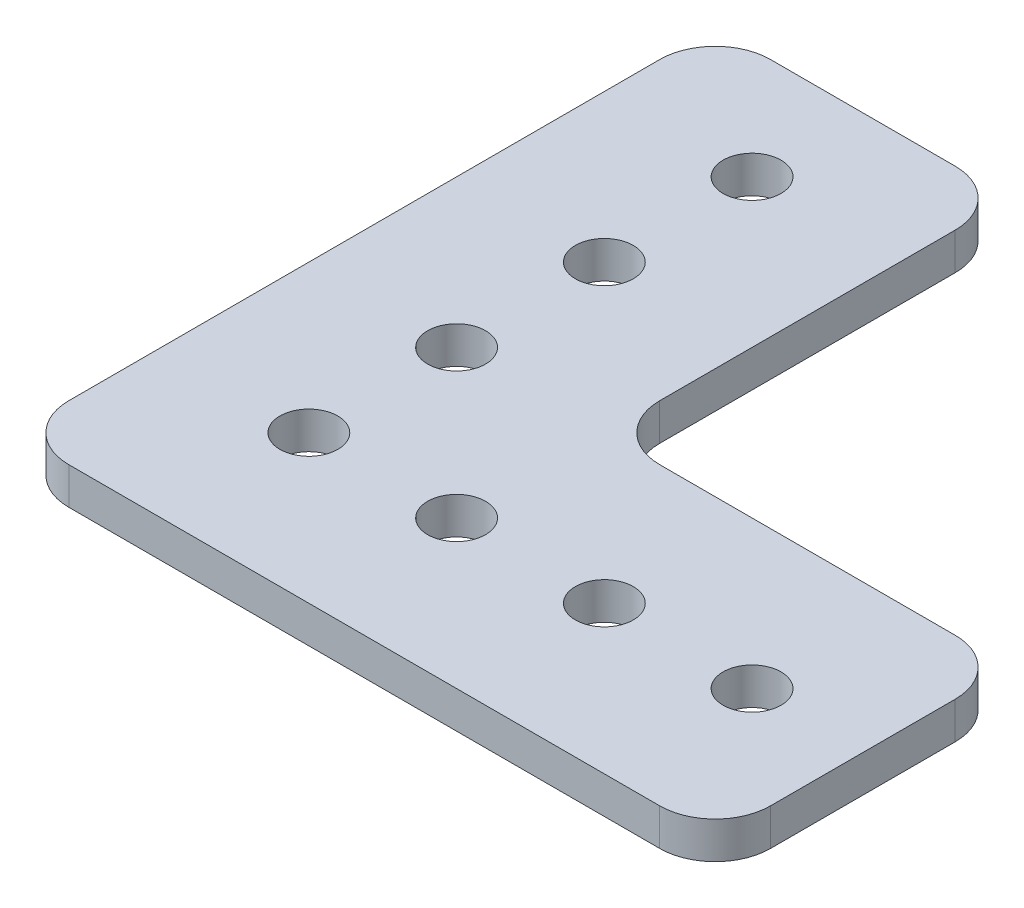
ISO-10303-21;
HEADER;
FILE_DESCRIPTION(('STEP AP214'),'2;1');
FILE_NAME('part.step','',(''),(''),'','','');
FILE_SCHEMA(('AUTOMOTIVE_DESIGN { 1 0 10303 214 1 1 1 1 }'));
ENDSEC;
DATA;
#1=APPLICATION_CONTEXT('core data for automotive mechanical design processes');
#2=APPLICATION_PROTOCOL_DEFINITION('international standard','automotive_design',2000,#1);
#3=PRODUCT_CONTEXT('',#1,'mechanical');
#4=PRODUCT('Part','Part','',(#3));
#5=PRODUCT_RELATED_PRODUCT_CATEGORY('part','',(#4));
#6=PRODUCT_DEFINITION_FORMATION('','',#4);
#7=PRODUCT_DEFINITION_CONTEXT('part definition',#1,'design');
#8=PRODUCT_DEFINITION('design','',#6,#7);
#9=PRODUCT_DEFINITION_SHAPE('','',#8);
#10=(LENGTH_UNIT() NAMED_UNIT(*) SI_UNIT(.MILLI.,.METRE.));
#11=(NAMED_UNIT(*) PLANE_ANGLE_UNIT() SI_UNIT($,.RADIAN.));
#12=(NAMED_UNIT(*) SI_UNIT($,.STERADIAN.) SOLID_ANGLE_UNIT());
#13=UNCERTAINTY_MEASURE_WITH_UNIT(LENGTH_MEASURE(1.E-05),#10,'distance_accuracy_value','');
#14=(GEOMETRIC_REPRESENTATION_CONTEXT(3) GLOBAL_UNCERTAINTY_ASSIGNED_CONTEXT((#13)) GLOBAL_UNIT_ASSIGNED_CONTEXT((#10,
#11,#12)) REPRESENTATION_CONTEXT('',''));
#15=CARTESIAN_POINT('',(0.,0.,0.));
#16=DIRECTION('',(0.,0.,1.));
#17=DIRECTION('',(1.,0.,0.));
#18=AXIS2_PLACEMENT_3D('',#15,#16,#17);
#19=CARTESIAN_POINT('',(0.,3.175,0.));
#20=DIRECTION('',(0.,-1.,0.));
#21=DIRECTION('',(0.,0.,-1.));
#22=AXIS2_PLACEMENT_3D('',#19,#20,#21);
#23=PLANE('',#22);
#24=DIRECTION('',(0.,0.,1.));
#25=VECTOR('',#24,1.);
#26=CARTESIAN_POINT('',(0.,3.175,0.));
#27=LINE('',#26,#25);
#28=CARTESIAN_POINT('',(0.,3.175,-55.5625));
#29=VERTEX_POINT('',#28);
#30=CARTESIAN_POINT('',(0.,3.175,-4.7625));
#31=VERTEX_POINT('',#30);
#32=EDGE_CURVE('E161',#29,#31,#27,.T.);
#33=ORIENTED_EDGE('',*,*,#32,.T.);
#34=CARTESIAN_POINT('',(4.7625,3.175,-4.7625));
#35=DIRECTION('',(0.,-1.,0.));
#36=DIRECTION('',(0.,0.,-1.));
#37=AXIS2_PLACEMENT_3D('',#34,#35,#36);
#38=CIRCLE('',#37,4.7625);
#39=CARTESIAN_POINT('',(4.76250000000002,3.175,0.));
#40=VERTEX_POINT('',#39);
#41=EDGE_CURVE('E189',#31,#40,#38,.F.);
#42=ORIENTED_EDGE('',*,*,#41,.T.);
#43=DIRECTION('',(1.,0.,0.));
#44=VECTOR('',#43,1.);
#45=CARTESIAN_POINT('',(60.325,3.175,0.));
#46=LINE('',#45,#44);
#47=CARTESIAN_POINT('',(55.5625,3.175,0.));
#48=VERTEX_POINT('',#47);
#49=EDGE_CURVE('E143',#40,#48,#46,.T.);
#50=ORIENTED_EDGE('',*,*,#49,.T.);
#51=CARTESIAN_POINT('',(55.5625,3.175,-4.7625));
#52=DIRECTION('',(0.,-1.,0.));
#53=DIRECTION('',(0.,0.,-1.));
#54=AXIS2_PLACEMENT_3D('',#51,#52,#53);
#55=CIRCLE('',#54,4.7625);
#56=CARTESIAN_POINT('',(60.325,3.175,-4.7625));
#57=VERTEX_POINT('',#56);
#58=EDGE_CURVE('E183',#48,#57,#55,.F.);
#59=ORIENTED_EDGE('',*,*,#58,.T.);
#60=DIRECTION('',(0.,0.,-1.));
#61=VECTOR('',#60,1.);
#62=CARTESIAN_POINT('',(60.325,3.175,-25.4));
#63=LINE('',#62,#61);
#64=CARTESIAN_POINT('',(60.325,3.175,-20.6375));
#65=VERTEX_POINT('',#64);
#66=EDGE_CURVE('E231',#57,#65,#63,.T.);
#67=ORIENTED_EDGE('',*,*,#66,.T.);
#68=CARTESIAN_POINT('',(55.5625,3.175,-20.6375));
#69=DIRECTION('',(0.,-1.,0.));
#70=DIRECTION('',(0.,0.,-1.));
#71=AXIS2_PLACEMENT_3D('',#68,#69,#70);
#72=CIRCLE('',#71,4.7625);
#73=CARTESIAN_POINT('',(55.5625,3.175,-25.4));
#74=VERTEX_POINT('',#73);
#75=EDGE_CURVE('E185',#65,#74,#72,.F.);
#76=ORIENTED_EDGE('',*,*,#75,.T.);
#77=DIRECTION('',(-1.,0.,0.));
#78=VECTOR('',#77,1.);
#79=CARTESIAN_POINT('',(25.4,3.175,-25.4));
#80=LINE('',#79,#78);
#81=CARTESIAN_POINT('',(30.1625,3.175,-25.4));
#82=VERTEX_POINT('',#81);
#83=EDGE_CURVE('E225',#74,#82,#80,.T.);
#84=ORIENTED_EDGE('',*,*,#83,.T.);
#85=CARTESIAN_POINT('',(30.1625,3.175,-30.1625));
#86=DIRECTION('',(0.,-1.,0.));
#87=DIRECTION('',(0.,0.,-1.));
#88=AXIS2_PLACEMENT_3D('',#85,#86,#87);
#89=CIRCLE('',#88,4.7625);
#90=CARTESIAN_POINT('',(25.4,3.175,-30.1625));
#91=VERTEX_POINT('',#90);
#92=EDGE_CURVE('E11',#82,#91,#89,.T.);
#93=ORIENTED_EDGE('',*,*,#92,.T.);
#94=DIRECTION('',(0.,0.,-1.));
#95=VECTOR('',#94,1.);
#96=CARTESIAN_POINT('',(25.4,3.175,-60.325));
#97=LINE('',#96,#95);
#98=CARTESIAN_POINT('',(25.4,3.175,-55.5625));
#99=VERTEX_POINT('',#98);
#100=EDGE_CURVE('E224',#91,#99,#97,.T.);
#101=ORIENTED_EDGE('',*,*,#100,.T.);
#102=CARTESIAN_POINT('',(20.6375,3.175,-55.5625));
#103=DIRECTION('',(0.,-1.,0.));
#104=DIRECTION('',(0.,0.,-1.));
#105=AXIS2_PLACEMENT_3D('',#102,#103,#104);
#106=CIRCLE('',#105,4.7625);
#107=CARTESIAN_POINT('',(20.6375,3.175,-60.325));
#108=VERTEX_POINT('',#107);
#109=EDGE_CURVE('E55',#99,#108,#106,.F.);
#110=ORIENTED_EDGE('',*,*,#109,.T.);
#111=DIRECTION('',(-1.,0.,0.));
#112=VECTOR('',#111,1.);
#113=CARTESIAN_POINT('',(0.,3.175,-60.325));
#114=LINE('',#113,#112);
#115=CARTESIAN_POINT('',(4.7625,3.175,-60.325));
#116=VERTEX_POINT('',#115);
#117=EDGE_CURVE('E229',#108,#116,#114,.T.);
#118=ORIENTED_EDGE('',*,*,#117,.T.);
#119=CARTESIAN_POINT('',(4.7625,3.175,-55.5625));
#120=DIRECTION('',(0.,-1.,0.));
#121=DIRECTION('',(0.,0.,-1.));
#122=AXIS2_PLACEMENT_3D('',#119,#120,#121);
#123=CIRCLE('',#122,4.7625);
#124=EDGE_CURVE('E187',#116,#29,#123,.F.);
#125=ORIENTED_EDGE('',*,*,#124,.T.);
#126=EDGE_LOOP('',(#33,#42,#50,#59,#67,#76,#84,#93,#101,#110,#118,#125));
#127=FACE_BOUND('',#126,.T.);
#128=CARTESIAN_POINT('',(12.7,3.175,-12.7));
#129=DIRECTION('',(0.,1.,0.));
#130=DIRECTION('',(0.,0.,1.));
#131=AXIS2_PLACEMENT_3D('',#128,#129,#130);
#132=CIRCLE('',#131,2.4892);
#133=CARTESIAN_POINT('',(12.7,3.175,-10.2108));
#134=VERTEX_POINT('',#133);
#135=EDGE_CURVE('E152',#134,#134,#132,.T.);
#136=ORIENTED_EDGE('',*,*,#135,.F.);
#137=EDGE_LOOP('',(#136));
#138=FACE_BOUND('',#137,.T.);
#139=CARTESIAN_POINT('',(50.8,3.175,-12.7));
#140=DIRECTION('',(0.,1.,0.));
#141=DIRECTION('',(0.,0.,1.));
#142=AXIS2_PLACEMENT_3D('',#139,#140,#141);
#143=CIRCLE('',#142,2.4892);
#144=CARTESIAN_POINT('',(50.8,3.175,-10.2108));
#145=VERTEX_POINT('',#144);
#146=EDGE_CURVE('E238',#145,#145,#143,.T.);
#147=ORIENTED_EDGE('',*,*,#146,.F.);
#148=EDGE_LOOP('',(#147));
#149=FACE_BOUND('',#148,.T.);
#150=CARTESIAN_POINT('',(12.7,3.175,-25.4));
#151=DIRECTION('',(0.,1.,0.));
#152=DIRECTION('',(0.,0.,1.));
#153=AXIS2_PLACEMENT_3D('',#150,#151,#152);
#154=CIRCLE('',#153,2.4892);
#155=CARTESIAN_POINT('',(12.7,3.175,-22.9108));
#156=VERTEX_POINT('',#155);
#157=EDGE_CURVE('E243',#156,#156,#154,.T.);
#158=ORIENTED_EDGE('',*,*,#157,.F.);
#159=EDGE_LOOP('',(#158));
#160=FACE_BOUND('',#159,.T.);
#161=CARTESIAN_POINT('',(12.7,3.175,-38.1));
#162=DIRECTION('',(0.,1.,0.));
#163=DIRECTION('',(0.,0.,1.));
#164=AXIS2_PLACEMENT_3D('',#161,#162,#163);
#165=CIRCLE('',#164,2.4892);
#166=CARTESIAN_POINT('',(12.7,3.175,-35.6108));
#167=VERTEX_POINT('',#166);
#168=EDGE_CURVE('E249',#167,#167,#165,.T.);
#169=ORIENTED_EDGE('',*,*,#168,.F.);
#170=EDGE_LOOP('',(#169));
#171=FACE_BOUND('',#170,.T.);
#172=CARTESIAN_POINT('',(25.4,3.175,-12.7));
#173=DIRECTION('',(0.,1.,0.));
#174=DIRECTION('',(0.,0.,1.));
#175=AXIS2_PLACEMENT_3D('',#172,#173,#174);
#176=CIRCLE('',#175,2.4892);
#177=CARTESIAN_POINT('',(25.4,3.175,-10.2108));
#178=VERTEX_POINT('',#177);
#179=EDGE_CURVE('E255',#178,#178,#176,.T.);
#180=ORIENTED_EDGE('',*,*,#179,.F.);
#181=EDGE_LOOP('',(#180));
#182=FACE_BOUND('',#181,.T.);
#183=CARTESIAN_POINT('',(38.1,3.175,-12.7));
#184=DIRECTION('',(0.,1.,0.));
#185=DIRECTION('',(0.,0.,1.));
#186=AXIS2_PLACEMENT_3D('',#183,#184,#185);
#187=CIRCLE('',#186,2.4892);
#188=CARTESIAN_POINT('',(38.1,3.175,-10.2108));
#189=VERTEX_POINT('',#188);
#190=EDGE_CURVE('E261',#189,#189,#187,.T.);
#191=ORIENTED_EDGE('',*,*,#190,.F.);
#192=EDGE_LOOP('',(#191));
#193=FACE_BOUND('',#192,.T.);
#194=CARTESIAN_POINT('',(12.7,3.175,-50.8));
#195=DIRECTION('',(0.,1.,0.));
#196=DIRECTION('',(0.,0.,1.));
#197=AXIS2_PLACEMENT_3D('',#194,#195,#196);
#198=CIRCLE('',#197,2.4892);
#199=CARTESIAN_POINT('',(12.7,3.175,-48.3108));
#200=VERTEX_POINT('',#199);
#201=EDGE_CURVE('E267',#200,#200,#198,.T.);
#202=ORIENTED_EDGE('',*,*,#201,.F.);
#203=EDGE_LOOP('',(#202));
#204=FACE_BOUND('',#203,.T.);
#205=ADVANCED_FACE('F33',(#127,#138,#149,#160,#171,#182,#193,#204),#23,.F.);
#206=CARTESIAN_POINT('',(0.,0.,0.));
#207=DIRECTION('',(0.,-1.,0.));
#208=DIRECTION('',(0.,0.,-1.));
#209=AXIS2_PLACEMENT_3D('',#206,#207,#208);
#210=PLANE('',#209);
#211=CARTESIAN_POINT('',(38.1,0.,-12.7));
#212=DIRECTION('',(0.,1.,0.));
#213=DIRECTION('',(0.,0.,1.));
#214=AXIS2_PLACEMENT_3D('',#211,#212,#213);
#215=CIRCLE('',#214,2.4892);
#216=CARTESIAN_POINT('',(38.1,0.,-10.2108));
#217=VERTEX_POINT('',#216);
#218=EDGE_CURVE('E264',#217,#217,#215,.T.);
#219=ORIENTED_EDGE('',*,*,#218,.T.);
#220=EDGE_LOOP('',(#219));
#221=FACE_BOUND('',#220,.T.);
#222=CARTESIAN_POINT('',(12.7,0.,-38.1));
#223=DIRECTION('',(0.,1.,0.));
#224=DIRECTION('',(0.,0.,1.));
#225=AXIS2_PLACEMENT_3D('',#222,#223,#224);
#226=CIRCLE('',#225,2.4892);
#227=CARTESIAN_POINT('',(12.7,0.,-35.6108));
#228=VERTEX_POINT('',#227);
#229=EDGE_CURVE('E252',#228,#228,#226,.T.);
#230=ORIENTED_EDGE('',*,*,#229,.T.);
#231=EDGE_LOOP('',(#230));
#232=FACE_BOUND('',#231,.T.);
#233=CARTESIAN_POINT('',(50.8,0.,-12.7));
#234=DIRECTION('',(0.,1.,0.));
#235=DIRECTION('',(0.,0.,1.));
#236=AXIS2_PLACEMENT_3D('',#233,#234,#235);
#237=CIRCLE('',#236,2.4892);
#238=CARTESIAN_POINT('',(50.8,0.,-10.2108));
#239=VERTEX_POINT('',#238);
#240=EDGE_CURVE('E240',#239,#239,#237,.T.);
#241=ORIENTED_EDGE('',*,*,#240,.T.);
#242=EDGE_LOOP('',(#241));
#243=FACE_BOUND('',#242,.T.);
#244=DIRECTION('',(1.,0.,0.));
#245=VECTOR('',#244,1.);
#246=CARTESIAN_POINT('',(60.325,0.,0.));
#247=LINE('',#246,#245);
#248=CARTESIAN_POINT('',(4.76250000000002,0.,0.));
#249=VERTEX_POINT('',#248);
#250=CARTESIAN_POINT('',(55.5625,0.,0.));
#251=VERTEX_POINT('',#250);
#252=EDGE_CURVE('E140',#249,#251,#247,.T.);
#253=ORIENTED_EDGE('',*,*,#252,.F.);
#254=CARTESIAN_POINT('',(4.7625,0.,-4.7625));
#255=DIRECTION('',(0.,-1.,0.));
#256=DIRECTION('',(0.,0.,-1.));
#257=AXIS2_PLACEMENT_3D('',#254,#255,#256);
#258=CIRCLE('',#257,4.7625);
#259=CARTESIAN_POINT('',(0.,0.,-4.7625));
#260=VERTEX_POINT('',#259);
#261=EDGE_CURVE('E123',#249,#260,#258,.T.);
#262=ORIENTED_EDGE('',*,*,#261,.T.);
#263=DIRECTION('',(0.,0.,1.));
#264=VECTOR('',#263,1.);
#265=CARTESIAN_POINT('',(0.,0.,0.));
#266=LINE('',#265,#264);
#267=CARTESIAN_POINT('',(0.,0.,-55.5625));
#268=VERTEX_POINT('',#267);
#269=EDGE_CURVE('E171',#268,#260,#266,.T.);
#270=ORIENTED_EDGE('',*,*,#269,.F.);
#271=CARTESIAN_POINT('',(4.7625,0.,-55.5625));
#272=DIRECTION('',(0.,-1.,0.));
#273=DIRECTION('',(0.,0.,-1.));
#274=AXIS2_PLACEMENT_3D('',#271,#272,#273);
#275=CIRCLE('',#274,4.7625);
#276=CARTESIAN_POINT('',(4.7625,0.,-60.325));
#277=VERTEX_POINT('',#276);
#278=EDGE_CURVE('E134',#268,#277,#275,.T.);
#279=ORIENTED_EDGE('',*,*,#278,.T.);
#280=DIRECTION('',(-1.,0.,0.));
#281=VECTOR('',#280,1.);
#282=CARTESIAN_POINT('',(0.,0.,-60.325));
#283=LINE('',#282,#281);
#284=CARTESIAN_POINT('',(20.6375,0.,-60.325));
#285=VERTEX_POINT('',#284);
#286=EDGE_CURVE('E169',#285,#277,#283,.T.);
#287=ORIENTED_EDGE('',*,*,#286,.F.);
#288=CARTESIAN_POINT('',(20.6375,0.,-55.5625));
#289=DIRECTION('',(0.,-1.,0.));
#290=DIRECTION('',(0.,0.,-1.));
#291=AXIS2_PLACEMENT_3D('',#288,#289,#290);
#292=CIRCLE('',#291,4.7625);
#293=CARTESIAN_POINT('',(25.4,0.,-55.5625));
#294=VERTEX_POINT('',#293);
#295=EDGE_CURVE('E144',#285,#294,#292,.T.);
#296=ORIENTED_EDGE('',*,*,#295,.T.);
#297=DIRECTION('',(0.,0.,-1.));
#298=VECTOR('',#297,1.);
#299=CARTESIAN_POINT('',(25.4,0.,-60.325));
#300=LINE('',#299,#298);
#301=CARTESIAN_POINT('',(25.4,0.,-30.1625));
#302=VERTEX_POINT('',#301);
#303=EDGE_CURVE('E166',#302,#294,#300,.T.);
#304=ORIENTED_EDGE('',*,*,#303,.F.);
#305=CARTESIAN_POINT('',(30.1625,0.,-30.1625));
#306=DIRECTION('',(0.,-1.,0.));
#307=DIRECTION('',(0.,0.,-1.));
#308=AXIS2_PLACEMENT_3D('',#305,#306,#307);
#309=CIRCLE('',#308,4.7625);
#310=CARTESIAN_POINT('',(30.1625,0.,-25.4));
#311=VERTEX_POINT('',#310);
#312=EDGE_CURVE('E41',#302,#311,#309,.F.);
#313=ORIENTED_EDGE('',*,*,#312,.T.);
#314=DIRECTION('',(-1.,0.,0.));
#315=VECTOR('',#314,1.);
#316=CARTESIAN_POINT('',(25.4,0.,-25.4));
#317=LINE('',#316,#315);
#318=CARTESIAN_POINT('',(55.5625,0.,-25.4));
#319=VERTEX_POINT('',#318);
#320=EDGE_CURVE('E155',#319,#311,#317,.T.);
#321=ORIENTED_EDGE('',*,*,#320,.F.);
#322=CARTESIAN_POINT('',(55.5625,0.,-20.6375));
#323=DIRECTION('',(0.,-1.,0.));
#324=DIRECTION('',(0.,0.,-1.));
#325=AXIS2_PLACEMENT_3D('',#322,#323,#324);
#326=CIRCLE('',#325,4.7625);
#327=CARTESIAN_POINT('',(60.325,0.,-20.6375));
#328=VERTEX_POINT('',#327);
#329=EDGE_CURVE('E176',#319,#328,#326,.T.);
#330=ORIENTED_EDGE('',*,*,#329,.T.);
#331=DIRECTION('',(0.,0.,-1.));
#332=VECTOR('',#331,1.);
#333=CARTESIAN_POINT('',(60.325,0.,-25.4));
#334=LINE('',#333,#332);
#335=CARTESIAN_POINT('',(60.325,0.,-4.7625));
#336=VERTEX_POINT('',#335);
#337=EDGE_CURVE('E151',#336,#328,#334,.T.);
#338=ORIENTED_EDGE('',*,*,#337,.F.);
#339=CARTESIAN_POINT('',(55.5625,0.,-4.7625));
#340=DIRECTION('',(0.,-1.,0.));
#341=DIRECTION('',(0.,0.,-1.));
#342=AXIS2_PLACEMENT_3D('',#339,#340,#341);
#343=CIRCLE('',#342,4.7625);
#344=EDGE_CURVE('E150',#336,#251,#343,.T.);
#345=ORIENTED_EDGE('',*,*,#344,.T.);
#346=EDGE_LOOP('',(#253,#262,#270,#279,#287,#296,#304,#313,#321,#330,#338,#345));
#347=FACE_BOUND('',#346,.T.);
#348=CARTESIAN_POINT('',(12.7,0.,-12.7));
#349=DIRECTION('',(0.,1.,0.));
#350=DIRECTION('',(0.,0.,1.));
#351=AXIS2_PLACEMENT_3D('',#348,#349,#350);
#352=CIRCLE('',#351,2.4892);
#353=CARTESIAN_POINT('',(12.7,0.,-10.2108));
#354=VERTEX_POINT('',#353);
#355=EDGE_CURVE('E158',#354,#354,#352,.T.);
#356=ORIENTED_EDGE('',*,*,#355,.T.);
#357=EDGE_LOOP('',(#356));
#358=FACE_BOUND('',#357,.T.);
#359=CARTESIAN_POINT('',(12.7,0.,-25.4));
#360=DIRECTION('',(0.,1.,0.));
#361=DIRECTION('',(0.,0.,1.));
#362=AXIS2_PLACEMENT_3D('',#359,#360,#361);
#363=CIRCLE('',#362,2.4892);
#364=CARTESIAN_POINT('',(12.7,0.,-22.9108));
#365=VERTEX_POINT('',#364);
#366=EDGE_CURVE('E246',#365,#365,#363,.T.);
#367=ORIENTED_EDGE('',*,*,#366,.T.);
#368=EDGE_LOOP('',(#367));
#369=FACE_BOUND('',#368,.T.);
#370=CARTESIAN_POINT('',(25.4,0.,-12.7));
#371=DIRECTION('',(0.,1.,0.));
#372=DIRECTION('',(0.,0.,1.));
#373=AXIS2_PLACEMENT_3D('',#370,#371,#372);
#374=CIRCLE('',#373,2.4892);
#375=CARTESIAN_POINT('',(25.4,0.,-10.2108));
#376=VERTEX_POINT('',#375);
#377=EDGE_CURVE('E258',#376,#376,#374,.T.);
#378=ORIENTED_EDGE('',*,*,#377,.T.);
#379=EDGE_LOOP('',(#378));
#380=FACE_BOUND('',#379,.T.);
#381=CARTESIAN_POINT('',(12.7,0.,-50.8));
#382=DIRECTION('',(0.,1.,0.));
#383=DIRECTION('',(0.,0.,1.));
#384=AXIS2_PLACEMENT_3D('',#381,#382,#383);
#385=CIRCLE('',#384,2.4892);
#386=CARTESIAN_POINT('',(12.7,0.,-48.3108));
#387=VERTEX_POINT('',#386);
#388=EDGE_CURVE('E270',#387,#387,#385,.T.);
#389=ORIENTED_EDGE('',*,*,#388,.T.);
#390=EDGE_LOOP('',(#389));
#391=FACE_BOUND('',#390,.T.);
#392=ADVANCED_FACE('F147',(#221,#232,#243,#347,#358,#369,#380,#391),#210,.T.);
#393=CARTESIAN_POINT('',(60.325,3.175,0.));
#394=DIRECTION('',(0.,0.,-1.));
#395=DIRECTION('',(-1.,0.,0.));
#396=AXIS2_PLACEMENT_3D('',#393,#394,#395);
#397=PLANE('',#396);
#398=ORIENTED_EDGE('',*,*,#49,.F.);
#399=DIRECTION('',(0.,-1.,0.));
#400=VECTOR('',#399,1.);
#401=CARTESIAN_POINT('',(4.7625,3.175,0.));
#402=LINE('',#401,#400);
#403=EDGE_CURVE('E127',#40,#249,#402,.T.);
#404=ORIENTED_EDGE('',*,*,#403,.T.);
#405=ORIENTED_EDGE('',*,*,#252,.T.);
#406=DIRECTION('',(0.,-1.,0.));
#407=VECTOR('',#406,1.);
#408=CARTESIAN_POINT('',(55.5625,3.175,0.));
#409=LINE('',#408,#407);
#410=EDGE_CURVE('E145',#251,#48,#409,.F.);
#411=ORIENTED_EDGE('',*,*,#410,.T.);
#412=EDGE_LOOP('',(#398,#404,#405,#411));
#413=FACE_BOUND('',#412,.T.);
#414=ADVANCED_FACE('F139',(#413),#397,.F.);
#415=CARTESIAN_POINT('',(60.325,3.175,-25.4));
#416=DIRECTION('',(-1.,0.,0.));
#417=DIRECTION('',(0.,0.,1.));
#418=AXIS2_PLACEMENT_3D('',#415,#416,#417);
#419=PLANE('',#418);
#420=ORIENTED_EDGE('',*,*,#337,.T.);
#421=DIRECTION('',(0.,-1.,0.));
#422=VECTOR('',#421,1.);
#423=CARTESIAN_POINT('',(60.325,3.175,-20.6375));
#424=LINE('',#423,#422);
#425=EDGE_CURVE('E208',#328,#65,#424,.F.);
#426=ORIENTED_EDGE('',*,*,#425,.T.);
#427=ORIENTED_EDGE('',*,*,#66,.F.);
#428=DIRECTION('',(0.,-1.,0.));
#429=VECTOR('',#428,1.);
#430=CARTESIAN_POINT('',(60.325,3.175,-4.7625));
#431=LINE('',#430,#429);
#432=EDGE_CURVE('E205',#57,#336,#431,.T.);
#433=ORIENTED_EDGE('',*,*,#432,.T.);
#434=EDGE_LOOP('',(#420,#426,#427,#433));
#435=FACE_BOUND('',#434,.T.);
#436=ADVANCED_FACE('F301',(#435),#419,.F.);
#437=CARTESIAN_POINT('',(25.4,3.175,-25.4));
#438=DIRECTION('',(0.,0.,1.));
#439=DIRECTION('',(1.,0.,0.));
#440=AXIS2_PLACEMENT_3D('',#437,#438,#439);
#441=PLANE('',#440);
#442=ORIENTED_EDGE('',*,*,#320,.T.);
#443=DIRECTION('',(0.,-1.,0.));
#444=VECTOR('',#443,1.);
#445=CARTESIAN_POINT('',(30.1625,3.175,-25.4));
#446=LINE('',#445,#444);
#447=EDGE_CURVE('E203',#311,#82,#446,.F.);
#448=ORIENTED_EDGE('',*,*,#447,.T.);
#449=ORIENTED_EDGE('',*,*,#83,.F.);
#450=DIRECTION('',(0.,-1.,0.));
#451=VECTOR('',#450,1.);
#452=CARTESIAN_POINT('',(55.5625,3.175,-25.4));
#453=LINE('',#452,#451);
#454=EDGE_CURVE('E200',#74,#319,#453,.T.);
#455=ORIENTED_EDGE('',*,*,#454,.T.);
#456=EDGE_LOOP('',(#442,#448,#449,#455));
#457=FACE_BOUND('',#456,.T.);
#458=ADVANCED_FACE('F215',(#457),#441,.F.);
#459=CARTESIAN_POINT('',(25.4,3.175,-60.325));
#460=DIRECTION('',(-1.,0.,0.));
#461=DIRECTION('',(0.,0.,1.));
#462=AXIS2_PLACEMENT_3D('',#459,#460,#461);
#463=PLANE('',#462);
#464=ORIENTED_EDGE('',*,*,#100,.F.);
#465=DIRECTION('',(0.,-1.,0.));
#466=VECTOR('',#465,1.);
#467=CARTESIAN_POINT('',(25.4,0.,-30.1625));
#468=LINE('',#467,#466);
#469=EDGE_CURVE('E197',#91,#302,#468,.T.);
#470=ORIENTED_EDGE('',*,*,#469,.T.);
#471=ORIENTED_EDGE('',*,*,#303,.T.);
#472=DIRECTION('',(0.,-1.,0.));
#473=VECTOR('',#472,1.);
#474=CARTESIAN_POINT('',(25.4,3.175,-55.5625));
#475=LINE('',#474,#473);
#476=EDGE_CURVE('E195',#294,#99,#475,.F.);
#477=ORIENTED_EDGE('',*,*,#476,.T.);
#478=EDGE_LOOP('',(#464,#470,#471,#477));
#479=FACE_BOUND('',#478,.T.);
#480=ADVANCED_FACE('F227',(#479),#463,.F.);
#481=CARTESIAN_POINT('',(0.,3.175,-60.325));
#482=DIRECTION('',(0.,0.,1.));
#483=DIRECTION('',(1.,0.,0.));
#484=AXIS2_PLACEMENT_3D('',#481,#482,#483);
#485=PLANE('',#484);
#486=ORIENTED_EDGE('',*,*,#286,.T.);
#487=DIRECTION('',(0.,-1.,0.));
#488=VECTOR('',#487,1.);
#489=CARTESIAN_POINT('',(4.7625,3.175,-60.325));
#490=LINE('',#489,#488);
#491=EDGE_CURVE('E48',#277,#116,#490,.F.);
#492=ORIENTED_EDGE('',*,*,#491,.T.);
#493=ORIENTED_EDGE('',*,*,#117,.F.);
#494=DIRECTION('',(0.,-1.,0.));
#495=VECTOR('',#494,1.);
#496=CARTESIAN_POINT('',(20.6375,3.175,-60.325));
#497=LINE('',#496,#495);
#498=EDGE_CURVE('E191',#108,#285,#497,.T.);
#499=ORIENTED_EDGE('',*,*,#498,.T.);
#500=EDGE_LOOP('',(#486,#492,#493,#499));
#501=FACE_BOUND('',#500,.T.);
#502=ADVANCED_FACE('F293',(#501),#485,.F.);
#503=CARTESIAN_POINT('',(0.,3.175,0.));
#504=DIRECTION('',(1.,0.,0.));
#505=DIRECTION('',(0.,0.,-1.));
#506=AXIS2_PLACEMENT_3D('',#503,#504,#505);
#507=PLANE('',#506);
#508=ORIENTED_EDGE('',*,*,#269,.T.);
#509=DIRECTION('',(0.,-1.,0.));
#510=VECTOR('',#509,1.);
#511=CARTESIAN_POINT('',(0.,3.175,-4.7625));
#512=LINE('',#511,#510);
#513=EDGE_CURVE('E128',#260,#31,#512,.F.);
#514=ORIENTED_EDGE('',*,*,#513,.T.);
#515=ORIENTED_EDGE('',*,*,#32,.F.);
#516=DIRECTION('',(0.,-1.,0.));
#517=VECTOR('',#516,1.);
#518=CARTESIAN_POINT('',(0.,3.175,-55.5625));
#519=LINE('',#518,#517);
#520=EDGE_CURVE('E133',#29,#268,#519,.T.);
#521=ORIENTED_EDGE('',*,*,#520,.T.);
#522=EDGE_LOOP('',(#508,#514,#515,#521));
#523=FACE_BOUND('',#522,.T.);
#524=ADVANCED_FACE('F290',(#523),#507,.F.);
#525=CARTESIAN_POINT('',(12.7,3.175,-12.7));
#526=DIRECTION('',(0.,-1.,0.));
#527=DIRECTION('',(0.,0.,-1.));
#528=AXIS2_PLACEMENT_3D('',#525,#526,#527);
#529=CYLINDRICAL_SURFACE('',#528,2.4892);
#530=ORIENTED_EDGE('',*,*,#135,.T.);
#531=EDGE_LOOP('',(#530));
#532=FACE_BOUND('',#531,.T.);
#533=ORIENTED_EDGE('',*,*,#355,.F.);
#534=EDGE_LOOP('',(#533));
#535=FACE_BOUND('',#534,.T.);
#536=ADVANCED_FACE('F287',(#532,#535),#529,.F.);
#537=CARTESIAN_POINT('',(50.8,3.175,-12.7));
#538=DIRECTION('',(0.,-1.,0.));
#539=DIRECTION('',(0.,0.,-1.));
#540=AXIS2_PLACEMENT_3D('',#537,#538,#539);
#541=CYLINDRICAL_SURFACE('',#540,2.4892);
#542=ORIENTED_EDGE('',*,*,#146,.T.);
#543=EDGE_LOOP('',(#542));
#544=FACE_BOUND('',#543,.T.);
#545=ORIENTED_EDGE('',*,*,#240,.F.);
#546=EDGE_LOOP('',(#545));
#547=FACE_BOUND('',#546,.T.);
#548=ADVANCED_FACE('F461',(#544,#547),#541,.F.);
#549=CARTESIAN_POINT('',(12.7,3.175,-25.4));
#550=DIRECTION('',(0.,-1.,0.));
#551=DIRECTION('',(0.,0.,-1.));
#552=AXIS2_PLACEMENT_3D('',#549,#550,#551);
#553=CYLINDRICAL_SURFACE('',#552,2.4892);
#554=ORIENTED_EDGE('',*,*,#157,.T.);
#555=EDGE_LOOP('',(#554));
#556=FACE_BOUND('',#555,.T.);
#557=ORIENTED_EDGE('',*,*,#366,.F.);
#558=EDGE_LOOP('',(#557));
#559=FACE_BOUND('',#558,.T.);
#560=ADVANCED_FACE('F451',(#556,#559),#553,.F.);
#561=CARTESIAN_POINT('',(12.7,3.175,-38.1));
#562=DIRECTION('',(0.,-1.,0.));
#563=DIRECTION('',(0.,0.,-1.));
#564=AXIS2_PLACEMENT_3D('',#561,#562,#563);
#565=CYLINDRICAL_SURFACE('',#564,2.4892);
#566=ORIENTED_EDGE('',*,*,#168,.T.);
#567=EDGE_LOOP('',(#566));
#568=FACE_BOUND('',#567,.T.);
#569=ORIENTED_EDGE('',*,*,#229,.F.);
#570=EDGE_LOOP('',(#569));
#571=FACE_BOUND('',#570,.T.);
#572=ADVANCED_FACE('F441',(#568,#571),#565,.F.);
#573=CARTESIAN_POINT('',(25.4,3.175,-12.7));
#574=DIRECTION('',(0.,-1.,0.));
#575=DIRECTION('',(0.,0.,-1.));
#576=AXIS2_PLACEMENT_3D('',#573,#574,#575);
#577=CYLINDRICAL_SURFACE('',#576,2.4892);
#578=ORIENTED_EDGE('',*,*,#179,.T.);
#579=EDGE_LOOP('',(#578));
#580=FACE_BOUND('',#579,.T.);
#581=ORIENTED_EDGE('',*,*,#377,.F.);
#582=EDGE_LOOP('',(#581));
#583=FACE_BOUND('',#582,.T.);
#584=ADVANCED_FACE('F431',(#580,#583),#577,.F.);
#585=CARTESIAN_POINT('',(38.1,3.175,-12.7));
#586=DIRECTION('',(0.,-1.,0.));
#587=DIRECTION('',(0.,0.,-1.));
#588=AXIS2_PLACEMENT_3D('',#585,#586,#587);
#589=CYLINDRICAL_SURFACE('',#588,2.4892);
#590=ORIENTED_EDGE('',*,*,#190,.T.);
#591=EDGE_LOOP('',(#590));
#592=FACE_BOUND('',#591,.T.);
#593=ORIENTED_EDGE('',*,*,#218,.F.);
#594=EDGE_LOOP('',(#593));
#595=FACE_BOUND('',#594,.T.);
#596=ADVANCED_FACE('F422',(#592,#595),#589,.F.);
#597=CARTESIAN_POINT('',(12.7,3.175,-50.8));
#598=DIRECTION('',(0.,-1.,0.));
#599=DIRECTION('',(0.,0.,-1.));
#600=AXIS2_PLACEMENT_3D('',#597,#598,#599);
#601=CYLINDRICAL_SURFACE('',#600,2.4892);
#602=ORIENTED_EDGE('',*,*,#201,.T.);
#603=EDGE_LOOP('',(#602));
#604=FACE_BOUND('',#603,.T.);
#605=ORIENTED_EDGE('',*,*,#388,.F.);
#606=EDGE_LOOP('',(#605));
#607=FACE_BOUND('',#606,.T.);
#608=ADVANCED_FACE('F276',(#604,#607),#601,.F.);
#609=CARTESIAN_POINT('',(4.7625,3.175,-4.7625));
#610=DIRECTION('',(0.,-1.,0.));
#611=DIRECTION('',(0.,0.,-1.));
#612=AXIS2_PLACEMENT_3D('',#609,#610,#611);
#613=CYLINDRICAL_SURFACE('',#612,4.7625);
#614=ORIENTED_EDGE('',*,*,#41,.F.);
#615=ORIENTED_EDGE('',*,*,#513,.F.);
#616=ORIENTED_EDGE('',*,*,#261,.F.);
#617=ORIENTED_EDGE('',*,*,#403,.F.);
#618=EDGE_LOOP('',(#614,#615,#616,#617));
#619=FACE_BOUND('',#618,.T.);
#620=ADVANCED_FACE('F126',(#619),#613,.T.);
#621=CARTESIAN_POINT('',(4.7625,3.175,-55.5625));
#622=DIRECTION('',(0.,-1.,0.));
#623=DIRECTION('',(0.,0.,-1.));
#624=AXIS2_PLACEMENT_3D('',#621,#622,#623);
#625=CYLINDRICAL_SURFACE('',#624,4.7625);
#626=ORIENTED_EDGE('',*,*,#124,.F.);
#627=ORIENTED_EDGE('',*,*,#491,.F.);
#628=ORIENTED_EDGE('',*,*,#278,.F.);
#629=ORIENTED_EDGE('',*,*,#520,.F.);
#630=EDGE_LOOP('',(#626,#627,#628,#629));
#631=FACE_BOUND('',#630,.T.);
#632=ADVANCED_FACE('F309',(#631),#625,.T.);
#633=CARTESIAN_POINT('',(30.1625,3.175,-30.1625));
#634=DIRECTION('',(0.,1.,0.));
#635=DIRECTION('',(0.,0.,1.));
#636=AXIS2_PLACEMENT_3D('',#633,#634,#635);
#637=CYLINDRICAL_SURFACE('',#636,4.7625);
#638=ORIENTED_EDGE('',*,*,#92,.F.);
#639=ORIENTED_EDGE('',*,*,#447,.F.);
#640=ORIENTED_EDGE('',*,*,#312,.F.);
#641=ORIENTED_EDGE('',*,*,#469,.F.);
#642=EDGE_LOOP('',(#638,#639,#640,#641));
#643=FACE_BOUND('',#642,.T.);
#644=ADVANCED_FACE('F220',(#643),#637,.F.);
#645=CARTESIAN_POINT('',(55.5625,3.175,-20.6375));
#646=DIRECTION('',(0.,-1.,0.));
#647=DIRECTION('',(0.,0.,-1.));
#648=AXIS2_PLACEMENT_3D('',#645,#646,#647);
#649=CYLINDRICAL_SURFACE('',#648,4.7625);
#650=ORIENTED_EDGE('',*,*,#75,.F.);
#651=ORIENTED_EDGE('',*,*,#425,.F.);
#652=ORIENTED_EDGE('',*,*,#329,.F.);
#653=ORIENTED_EDGE('',*,*,#454,.F.);
#654=EDGE_LOOP('',(#650,#651,#652,#653));
#655=FACE_BOUND('',#654,.T.);
#656=ADVANCED_FACE('F315',(#655),#649,.T.);
#657=CARTESIAN_POINT('',(55.5625,3.175,-4.7625));
#658=DIRECTION('',(0.,-1.,0.));
#659=DIRECTION('',(0.,0.,-1.));
#660=AXIS2_PLACEMENT_3D('',#657,#658,#659);
#661=CYLINDRICAL_SURFACE('',#660,4.7625);
#662=ORIENTED_EDGE('',*,*,#58,.F.);
#663=ORIENTED_EDGE('',*,*,#410,.F.);
#664=ORIENTED_EDGE('',*,*,#344,.F.);
#665=ORIENTED_EDGE('',*,*,#432,.F.);
#666=EDGE_LOOP('',(#662,#663,#664,#665));
#667=FACE_BOUND('',#666,.T.);
#668=ADVANCED_FACE('F317',(#667),#661,.T.);
#669=CARTESIAN_POINT('',(20.6375,3.175,-55.5625));
#670=DIRECTION('',(0.,-1.,0.));
#671=DIRECTION('',(0.,0.,-1.));
#672=AXIS2_PLACEMENT_3D('',#669,#670,#671);
#673=CYLINDRICAL_SURFACE('',#672,4.7625);
#674=ORIENTED_EDGE('',*,*,#109,.F.);
#675=ORIENTED_EDGE('',*,*,#476,.F.);
#676=ORIENTED_EDGE('',*,*,#295,.F.);
#677=ORIENTED_EDGE('',*,*,#498,.F.);
#678=EDGE_LOOP('',(#674,#675,#676,#677));
#679=FACE_BOUND('',#678,.T.);
#680=ADVANCED_FACE('F35',(#679),#673,.T.);
#681=CLOSED_SHELL('',(#205,#392,#414,#436,#458,#480,#502,#524,#536,#548,#560,#572,#584,#596,
#608,#620,#632,#644,#656,#668,#680));
#682=MANIFOLD_SOLID_BREP('B2',#681);
#683=ADVANCED_BREP_SHAPE_REPRESENTATION('',(#18,#682),#14);
#684=SHAPE_DEFINITION_REPRESENTATION(#9,#683);
ENDSEC;
END-ISO-10303-21;
